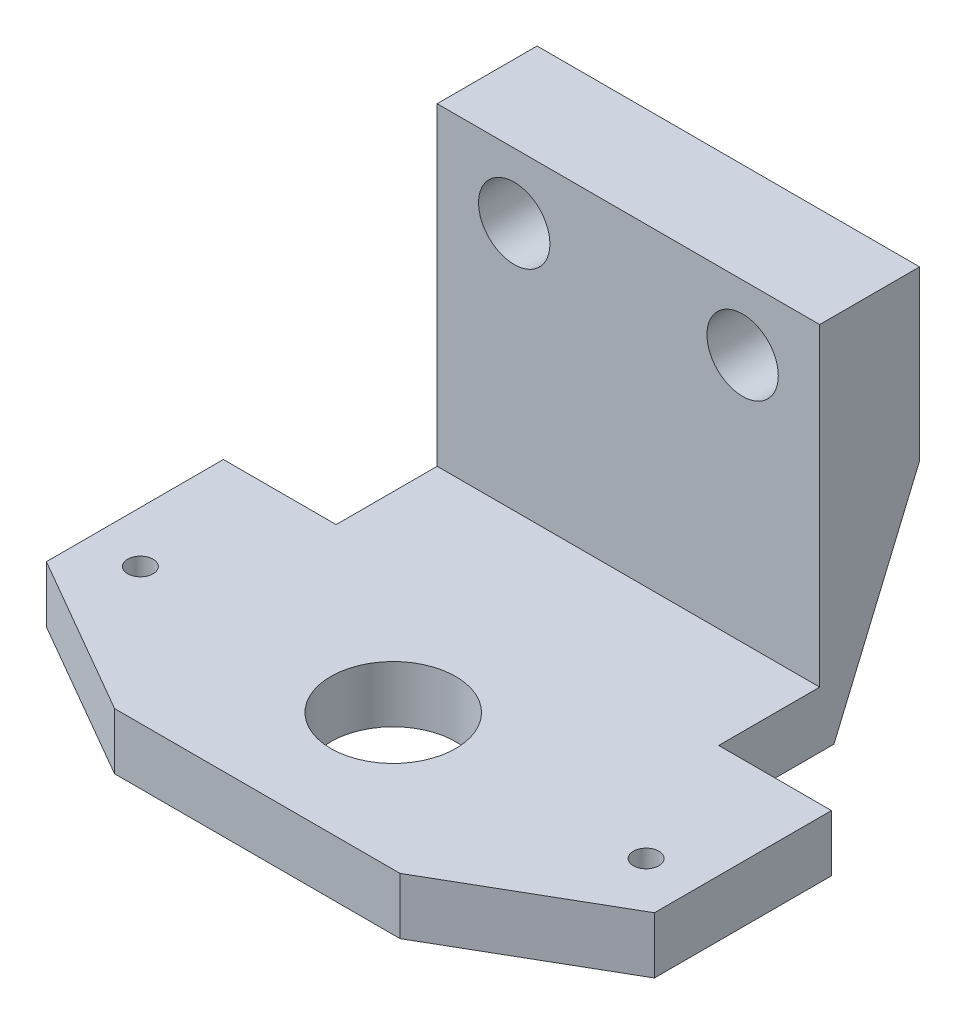
ISO-10303-21;
HEADER;
FILE_DESCRIPTION(('STEP AP214'),'2;1');
FILE_NAME('part.step','',(''),(''),'','','');
FILE_SCHEMA(('AUTOMOTIVE_DESIGN { 1 0 10303 214 1 1 1 1 }'));
ENDSEC;
DATA;
#1=APPLICATION_CONTEXT('core data for automotive mechanical design processes');
#2=APPLICATION_PROTOCOL_DEFINITION('international standard','automotive_design',2000,#1);
#3=PRODUCT_CONTEXT('',#1,'mechanical');
#4=PRODUCT('Part','Part','',(#3));
#5=PRODUCT_RELATED_PRODUCT_CATEGORY('part','',(#4));
#6=PRODUCT_DEFINITION_FORMATION('','',#4);
#7=PRODUCT_DEFINITION_CONTEXT('part definition',#1,'design');
#8=PRODUCT_DEFINITION('design','',#6,#7);
#9=PRODUCT_DEFINITION_SHAPE('','',#8);
#10=(LENGTH_UNIT() NAMED_UNIT(*) SI_UNIT(.MILLI.,.METRE.));
#11=(NAMED_UNIT(*) PLANE_ANGLE_UNIT() SI_UNIT($,.RADIAN.));
#12=(NAMED_UNIT(*) SI_UNIT($,.STERADIAN.) SOLID_ANGLE_UNIT());
#13=UNCERTAINTY_MEASURE_WITH_UNIT(LENGTH_MEASURE(1.E-05),#10,'distance_accuracy_value','');
#14=(GEOMETRIC_REPRESENTATION_CONTEXT(3) GLOBAL_UNCERTAINTY_ASSIGNED_CONTEXT((#13)) GLOBAL_UNIT_ASSIGNED_CONTEXT((#10,
#11,#12)) REPRESENTATION_CONTEXT('',''));
#15=CARTESIAN_POINT('',(0.,0.,0.));
#16=DIRECTION('',(0.,0.,1.));
#17=DIRECTION('',(1.,0.,0.));
#18=AXIS2_PLACEMENT_3D('',#15,#16,#17);
#19=CARTESIAN_POINT('',(17.018,5.0292,-16.8604462868597));
#20=DIRECTION('',(1.,0.,0.));
#21=DIRECTION('',(0.,0.,-1.));
#22=AXIS2_PLACEMENT_3D('',#19,#20,#21);
#23=PLANE('',#22);
#24=DIRECTION('',(0.,0.,1.));
#25=VECTOR('',#24,1.);
#26=CARTESIAN_POINT('',(17.018,0.,-16.8604462868597));
#27=LINE('',#26,#25);
#28=CARTESIAN_POINT('',(17.018,0.,-18.1304462868597));
#29=VERTEX_POINT('',#28);
#30=CARTESIAN_POINT('',(17.018,0.,-7.874));
#31=VERTEX_POINT('',#30);
#32=EDGE_CURVE('E155',#29,#31,#27,.T.);
#33=ORIENTED_EDGE('',*,*,#32,.F.);
#34=DIRECTION('',(0.,0.921146216293932,-0.389216711110112));
#35=VECTOR('',#34,1.);
#36=CARTESIAN_POINT('',(17.018,3.81200087527352,-19.7411508820457));
#37=LINE('',#36,#35);
#38=CARTESIAN_POINT('',(17.018,18.034,-25.7504462868597));
#39=VERTEX_POINT('',#38);
#40=EDGE_CURVE('E153',#29,#39,#37,.T.);
#41=ORIENTED_EDGE('',*,*,#40,.T.);
#42=DIRECTION('',(0.,-1.,0.));
#43=VECTOR('',#42,1.);
#44=CARTESIAN_POINT('',(17.018,32.9692,-25.7504462868597));
#45=LINE('',#44,#43);
#46=CARTESIAN_POINT('',(17.018,32.9692,-25.7504462868597));
#47=VERTEX_POINT('',#46);
#48=EDGE_CURVE('E141',#47,#39,#45,.T.);
#49=ORIENTED_EDGE('',*,*,#48,.F.);
#50=DIRECTION('',(0.,0.,-1.));
#51=VECTOR('',#50,1.);
#52=CARTESIAN_POINT('',(17.018,32.9692,-25.7504462868597));
#53=LINE('',#52,#51);
#54=CARTESIAN_POINT('',(17.018,32.9692,-16.8604462868597));
#55=VERTEX_POINT('',#54);
#56=EDGE_CURVE('E174',#55,#47,#53,.T.);
#57=ORIENTED_EDGE('',*,*,#56,.F.);
#58=DIRECTION('',(0.,-1.,0.));
#59=VECTOR('',#58,1.);
#60=CARTESIAN_POINT('',(17.018,32.9692,-16.8604462868597));
#61=LINE('',#60,#59);
#62=CARTESIAN_POINT('',(17.018,5.0292,-16.8604462868597));
#63=VERTEX_POINT('',#62);
#64=EDGE_CURVE('E149',#55,#63,#61,.T.);
#65=ORIENTED_EDGE('',*,*,#64,.T.);
#66=DIRECTION('',(0.,0.,1.));
#67=VECTOR('',#66,1.);
#68=CARTESIAN_POINT('',(17.018,5.0292,-16.8604462868597));
#69=LINE('',#68,#67);
#70=CARTESIAN_POINT('',(17.018,5.0292,-7.874));
#71=VERTEX_POINT('',#70);
#72=EDGE_CURVE('E206',#63,#71,#69,.T.);
#73=ORIENTED_EDGE('',*,*,#72,.T.);
#74=DIRECTION('',(0.,-1.,0.));
#75=VECTOR('',#74,1.);
#76=CARTESIAN_POINT('',(17.018,5.0292,-7.874));
#77=LINE('',#76,#75);
#78=EDGE_CURVE('E276',#71,#31,#77,.T.);
#79=ORIENTED_EDGE('',*,*,#78,.T.);
#80=EDGE_LOOP('',(#33,#41,#49,#57,#65,#73,#79));
#81=FACE_BOUND('',#80,.T.);
#82=ADVANCED_FACE('F43',(#81),#23,.T.);
#83=CARTESIAN_POINT('',(-17.018,5.0292,-7.874));
#84=DIRECTION('',(-1.,0.,0.));
#85=DIRECTION('',(0.,0.,1.));
#86=AXIS2_PLACEMENT_3D('',#83,#84,#85);
#87=PLANE('',#86);
#88=DIRECTION('',(0.,-1.,0.));
#89=VECTOR('',#88,1.);
#90=CARTESIAN_POINT('',(-17.018,32.9692,-25.7504462868597));
#91=LINE('',#90,#89);
#92=CARTESIAN_POINT('',(-17.018,32.9692,-25.7504462868597));
#93=VERTEX_POINT('',#92);
#94=CARTESIAN_POINT('',(-17.018,18.034,-25.7504462868597));
#95=VERTEX_POINT('',#94);
#96=EDGE_CURVE('E150',#93,#95,#91,.T.);
#97=ORIENTED_EDGE('',*,*,#96,.T.);
#98=DIRECTION('',(0.,-0.921146216293932,0.389216711110112));
#99=VECTOR('',#98,1.);
#100=CARTESIAN_POINT('',(-17.018,0.590130720247251,-18.3797972954148));
#101=LINE('',#100,#99);
#102=CARTESIAN_POINT('',(-17.018,0.,-18.1304462868597));
#103=VERTEX_POINT('',#102);
#104=EDGE_CURVE('E67',#95,#103,#101,.T.);
#105=ORIENTED_EDGE('',*,*,#104,.T.);
#106=DIRECTION('',(0.,0.,-1.));
#107=VECTOR('',#106,1.);
#108=CARTESIAN_POINT('',(-17.018,0.,-7.874));
#109=LINE('',#108,#107);
#110=CARTESIAN_POINT('',(-17.018,0.,-7.874));
#111=VERTEX_POINT('',#110);
#112=EDGE_CURVE('E238',#111,#103,#109,.T.);
#113=ORIENTED_EDGE('',*,*,#112,.F.);
#114=DIRECTION('',(0.,-1.,0.));
#115=VECTOR('',#114,1.);
#116=CARTESIAN_POINT('',(-17.018,5.0292,-7.874));
#117=LINE('',#116,#115);
#118=CARTESIAN_POINT('',(-17.018,5.0292,-7.874));
#119=VERTEX_POINT('',#118);
#120=EDGE_CURVE('E279',#119,#111,#117,.T.);
#121=ORIENTED_EDGE('',*,*,#120,.F.);
#122=DIRECTION('',(0.,0.,-1.));
#123=VECTOR('',#122,1.);
#124=CARTESIAN_POINT('',(-17.018,5.0292,-7.874));
#125=LINE('',#124,#123);
#126=CARTESIAN_POINT('',(-17.018,5.0292,-16.8604462868597));
#127=VERTEX_POINT('',#126);
#128=EDGE_CURVE('E198',#119,#127,#125,.T.);
#129=ORIENTED_EDGE('',*,*,#128,.T.);
#130=DIRECTION('',(0.,-1.,0.));
#131=VECTOR('',#130,1.);
#132=CARTESIAN_POINT('',(-17.018,32.9692,-16.8604462868597));
#133=LINE('',#132,#131);
#134=CARTESIAN_POINT('',(-17.018,32.9692,-16.8604462868597));
#135=VERTEX_POINT('',#134);
#136=EDGE_CURVE('E184',#135,#127,#133,.T.);
#137=ORIENTED_EDGE('',*,*,#136,.F.);
#138=DIRECTION('',(0.,0.,1.));
#139=VECTOR('',#138,1.);
#140=CARTESIAN_POINT('',(-17.018,32.9692,-25.7504462868597));
#141=LINE('',#140,#139);
#142=EDGE_CURVE('E158',#93,#135,#141,.T.);
#143=ORIENTED_EDGE('',*,*,#142,.F.);
#144=EDGE_LOOP('',(#97,#105,#113,#121,#129,#137,#143));
#145=FACE_BOUND('',#144,.T.);
#146=ADVANCED_FACE('F300',(#145),#87,.T.);
#147=CARTESIAN_POINT('',(0.,0.,0.));
#148=DIRECTION('',(0.,-1.,0.));
#149=DIRECTION('',(0.,0.,-1.));
#150=AXIS2_PLACEMENT_3D('',#147,#148,#149);
#151=PLANE('',#150);
#152=CARTESIAN_POINT('',(-22.5,0.,4.064));
#153=DIRECTION('',(0.,1.,0.));
#154=DIRECTION('',(0.,0.,1.));
#155=AXIS2_PLACEMENT_3D('',#152,#153,#154);
#156=CIRCLE('',#155,1.1303);
#157=CARTESIAN_POINT('',(-22.5,0.,5.1943));
#158=VERTEX_POINT('',#157);
#159=EDGE_CURVE('E530',#158,#158,#156,.T.);
#160=ORIENTED_EDGE('',*,*,#159,.T.);
#161=EDGE_LOOP('',(#160));
#162=FACE_BOUND('',#161,.T.);
#163=CARTESIAN_POINT('',(22.5,0.,4.064));
#164=DIRECTION('',(0.,1.,0.));
#165=DIRECTION('',(0.,0.,1.));
#166=AXIS2_PLACEMENT_3D('',#163,#164,#165);
#167=CIRCLE('',#166,1.1303);
#168=CARTESIAN_POINT('',(22.5,0.,5.1943));
#169=VERTEX_POINT('',#168);
#170=EDGE_CURVE('E519',#169,#169,#167,.T.);
#171=ORIENTED_EDGE('',*,*,#170,.T.);
#172=EDGE_LOOP('',(#171));
#173=FACE_BOUND('',#172,.T.);
#174=CARTESIAN_POINT('',(0.,0.,4.064));
#175=DIRECTION('',(0.,1.,0.));
#176=DIRECTION('',(0.,0.,1.));
#177=AXIS2_PLACEMENT_3D('',#174,#175,#176);
#178=CIRCLE('',#177,5.55625);
#179=CARTESIAN_POINT('',(0.,0.,9.62025));
#180=VERTEX_POINT('',#179);
#181=EDGE_CURVE('E514',#180,#180,#178,.T.);
#182=ORIENTED_EDGE('',*,*,#181,.T.);
#183=EDGE_LOOP('',(#182));
#184=FACE_BOUND('',#183,.T.);
#185=ORIENTED_EDGE('',*,*,#112,.T.);
#186=DIRECTION('',(-1.,0.,0.));
#187=VECTOR('',#186,1.);
#188=CARTESIAN_POINT('',(167.058537132019,0.,-18.1304462868597));
#189=LINE('',#188,#187);
#190=EDGE_CURVE('E59',#29,#103,#189,.T.);
#191=ORIENTED_EDGE('',*,*,#190,.F.);
#192=ORIENTED_EDGE('',*,*,#32,.T.);
#193=DIRECTION('',(1.,0.,0.));
#194=VECTOR('',#193,1.);
#195=CARTESIAN_POINT('',(17.018,0.,-7.874));
#196=LINE('',#195,#194);
#197=CARTESIAN_POINT('',(27.051,0.,-7.874));
#198=VERTEX_POINT('',#197);
#199=EDGE_CURVE('E243',#31,#198,#196,.T.);
#200=ORIENTED_EDGE('',*,*,#199,.T.);
#201=DIRECTION('',(0.,0.,1.));
#202=VECTOR('',#201,1.);
#203=CARTESIAN_POINT('',(27.051,0.,-7.874));
#204=LINE('',#203,#202);
#205=CARTESIAN_POINT('',(27.051,0.,7.874));
#206=VERTEX_POINT('',#205);
#207=EDGE_CURVE('E247',#198,#206,#204,.T.);
#208=ORIENTED_EDGE('',*,*,#207,.T.);
#209=DIRECTION('',(-0.866025403784438,0.,0.500000000000001));
#210=VECTOR('',#209,1.);
#211=CARTESIAN_POINT('',(27.051,0.,7.874));
#212=LINE('',#211,#210);
#213=CARTESIAN_POINT('',(12.7,0.,16.1595537131403));
#214=VERTEX_POINT('',#213);
#215=EDGE_CURVE('E251',#206,#214,#212,.T.);
#216=ORIENTED_EDGE('',*,*,#215,.T.);
#217=DIRECTION('',(-1.,0.,0.));
#218=VECTOR('',#217,1.);
#219=CARTESIAN_POINT('',(12.7,0.,16.1595537131403));
#220=LINE('',#219,#218);
#221=CARTESIAN_POINT('',(-12.7,0.,16.1595537131403));
#222=VERTEX_POINT('',#221);
#223=EDGE_CURVE('E255',#214,#222,#220,.T.);
#224=ORIENTED_EDGE('',*,*,#223,.T.);
#225=DIRECTION('',(-0.866025403784438,0.,-0.500000000000001));
#226=VECTOR('',#225,1.);
#227=CARTESIAN_POINT('',(-12.7,0.,16.1595537131403));
#228=LINE('',#227,#226);
#229=CARTESIAN_POINT('',(-27.051,0.,7.874));
#230=VERTEX_POINT('',#229);
#231=EDGE_CURVE('E194',#222,#230,#228,.T.);
#232=ORIENTED_EDGE('',*,*,#231,.T.);
#233=DIRECTION('',(0.,0.,-1.));
#234=VECTOR('',#233,1.);
#235=CARTESIAN_POINT('',(-27.051,0.,7.874));
#236=LINE('',#235,#234);
#237=CARTESIAN_POINT('',(-27.051,0.,-7.874));
#238=VERTEX_POINT('',#237);
#239=EDGE_CURVE('E188',#230,#238,#236,.T.);
#240=ORIENTED_EDGE('',*,*,#239,.T.);
#241=DIRECTION('',(1.,0.,0.));
#242=VECTOR('',#241,1.);
#243=CARTESIAN_POINT('',(-27.051,0.,-7.874));
#244=LINE('',#243,#242);
#245=EDGE_CURVE('E234',#238,#111,#244,.T.);
#246=ORIENTED_EDGE('',*,*,#245,.T.);
#247=EDGE_LOOP('',(#185,#191,#192,#200,#208,#216,#224,#232,#240,#246));
#248=FACE_BOUND('',#247,.T.);
#249=ADVANCED_FACE('F289',(#162,#173,#184,#248),#151,.T.);
#250=CARTESIAN_POINT('',(17.018,32.9692,-25.7504462868597));
#251=DIRECTION('',(0.,0.,1.));
#252=DIRECTION('',(1.,0.,0.));
#253=AXIS2_PLACEMENT_3D('',#250,#251,#252);
#254=PLANE('',#253);
#255=CARTESIAN_POINT('',(-10.16,27.178,-25.7504462868597));
#256=DIRECTION('',(0.,0.,1.));
#257=DIRECTION('',(1.,0.,0.));
#258=AXIS2_PLACEMENT_3D('',#255,#256,#257);
#259=CIRCLE('',#258,3.175);
#260=CARTESIAN_POINT('',(-6.985,27.178,-25.7504462868597));
#261=VERTEX_POINT('',#260);
#262=EDGE_CURVE('E504',#261,#261,#259,.T.);
#263=ORIENTED_EDGE('',*,*,#262,.T.);
#264=EDGE_LOOP('',(#263));
#265=FACE_BOUND('',#264,.T.);
#266=CARTESIAN_POINT('',(10.16,27.178,-25.7504462868597));
#267=DIRECTION('',(0.,0.,1.));
#268=DIRECTION('',(1.,0.,0.));
#269=AXIS2_PLACEMENT_3D('',#266,#267,#268);
#270=CIRCLE('',#269,3.175);
#271=CARTESIAN_POINT('',(13.335,27.178,-25.7504462868597));
#272=VERTEX_POINT('',#271);
#273=EDGE_CURVE('E164',#272,#272,#270,.T.);
#274=ORIENTED_EDGE('',*,*,#273,.T.);
#275=EDGE_LOOP('',(#274));
#276=FACE_BOUND('',#275,.T.);
#277=DIRECTION('',(1.,0.,0.));
#278=VECTOR('',#277,1.);
#279=CARTESIAN_POINT('',(17.018,18.034,-25.7504462868597));
#280=LINE('',#279,#278);
#281=EDGE_CURVE('E11',#95,#39,#280,.T.);
#282=ORIENTED_EDGE('',*,*,#281,.F.);
#283=ORIENTED_EDGE('',*,*,#96,.F.);
#284=DIRECTION('',(-1.,0.,0.));
#285=VECTOR('',#284,1.);
#286=CARTESIAN_POINT('',(17.018,32.9692,-25.7504462868597));
#287=LINE('',#286,#285);
#288=EDGE_CURVE('E145',#47,#93,#287,.T.);
#289=ORIENTED_EDGE('',*,*,#288,.F.);
#290=ORIENTED_EDGE('',*,*,#48,.T.);
#291=EDGE_LOOP('',(#282,#283,#289,#290));
#292=FACE_BOUND('',#291,.T.);
#293=ADVANCED_FACE('F143',(#265,#276,#292),#254,.F.);
#294=CARTESIAN_POINT('',(-27.051,5.0292,7.874));
#295=DIRECTION('',(-1.,0.,0.));
#296=DIRECTION('',(0.,0.,1.));
#297=AXIS2_PLACEMENT_3D('',#294,#295,#296);
#298=PLANE('',#297);
#299=ORIENTED_EDGE('',*,*,#239,.F.);
#300=DIRECTION('',(0.,-1.,0.));
#301=VECTOR('',#300,1.);
#302=CARTESIAN_POINT('',(-27.051,5.0292,7.874));
#303=LINE('',#302,#301);
#304=CARTESIAN_POINT('',(-27.051,5.0292,7.874));
#305=VERTEX_POINT('',#304);
#306=EDGE_CURVE('E52',#305,#230,#303,.T.);
#307=ORIENTED_EDGE('',*,*,#306,.F.);
#308=DIRECTION('',(0.,0.,-1.));
#309=VECTOR('',#308,1.);
#310=CARTESIAN_POINT('',(-27.051,5.0292,7.874));
#311=LINE('',#310,#309);
#312=CARTESIAN_POINT('',(-27.051,5.0292,-7.874));
#313=VERTEX_POINT('',#312);
#314=EDGE_CURVE('E189',#305,#313,#311,.T.);
#315=ORIENTED_EDGE('',*,*,#314,.T.);
#316=DIRECTION('',(0.,-1.,0.));
#317=VECTOR('',#316,1.);
#318=CARTESIAN_POINT('',(-27.051,5.0292,-7.874));
#319=LINE('',#318,#317);
#320=EDGE_CURVE('E230',#313,#238,#319,.T.);
#321=ORIENTED_EDGE('',*,*,#320,.T.);
#322=EDGE_LOOP('',(#299,#307,#315,#321));
#323=FACE_BOUND('',#322,.T.);
#324=ADVANCED_FACE('F45',(#323),#298,.T.);
#325=CARTESIAN_POINT('',(-12.7,5.0292,16.1595537131403));
#326=DIRECTION('',(-0.500000000000001,0.,0.866025403784438));
#327=DIRECTION('',(0.866025403784438,0.,0.500000000000001));
#328=AXIS2_PLACEMENT_3D('',#325,#326,#327);
#329=PLANE('',#328);
#330=ORIENTED_EDGE('',*,*,#231,.F.);
#331=DIRECTION('',(0.,-1.,0.));
#332=VECTOR('',#331,1.);
#333=CARTESIAN_POINT('',(-12.7,5.0292,16.1595537131403));
#334=LINE('',#333,#332);
#335=CARTESIAN_POINT('',(-12.7,5.0292,16.1595537131403));
#336=VERTEX_POINT('',#335);
#337=EDGE_CURVE('E264',#336,#222,#334,.T.);
#338=ORIENTED_EDGE('',*,*,#337,.F.);
#339=DIRECTION('',(-0.866025403784438,0.,-0.500000000000001));
#340=VECTOR('',#339,1.);
#341=CARTESIAN_POINT('',(-12.7,5.0292,16.1595537131403));
#342=LINE('',#341,#340);
#343=EDGE_CURVE('E226',#336,#305,#342,.T.);
#344=ORIENTED_EDGE('',*,*,#343,.T.);
#345=ORIENTED_EDGE('',*,*,#306,.T.);
#346=EDGE_LOOP('',(#330,#338,#344,#345));
#347=FACE_BOUND('',#346,.T.);
#348=ADVANCED_FACE('F293',(#347),#329,.T.);
#349=CARTESIAN_POINT('',(12.7,5.0292,16.1595537131403));
#350=DIRECTION('',(0.,0.,1.));
#351=DIRECTION('',(1.,0.,0.));
#352=AXIS2_PLACEMENT_3D('',#349,#350,#351);
#353=PLANE('',#352);
#354=ORIENTED_EDGE('',*,*,#223,.F.);
#355=DIRECTION('',(0.,-1.,0.));
#356=VECTOR('',#355,1.);
#357=CARTESIAN_POINT('',(12.7,5.0292,16.1595537131403));
#358=LINE('',#357,#356);
#359=CARTESIAN_POINT('',(12.7,5.0292,16.1595537131403));
#360=VERTEX_POINT('',#359);
#361=EDGE_CURVE('E267',#360,#214,#358,.T.);
#362=ORIENTED_EDGE('',*,*,#361,.F.);
#363=DIRECTION('',(-1.,0.,0.));
#364=VECTOR('',#363,1.);
#365=CARTESIAN_POINT('',(12.7,5.0292,16.1595537131403));
#366=LINE('',#365,#364);
#367=EDGE_CURVE('E222',#360,#336,#366,.T.);
#368=ORIENTED_EDGE('',*,*,#367,.T.);
#369=ORIENTED_EDGE('',*,*,#337,.T.);
#370=EDGE_LOOP('',(#354,#362,#368,#369));
#371=FACE_BOUND('',#370,.T.);
#372=ADVANCED_FACE('F320',(#371),#353,.T.);
#373=CARTESIAN_POINT('',(27.051,5.0292,7.874));
#374=DIRECTION('',(0.500000000000001,0.,0.866025403784438));
#375=DIRECTION('',(0.866025403784438,0.,-0.500000000000001));
#376=AXIS2_PLACEMENT_3D('',#373,#374,#375);
#377=PLANE('',#376);
#378=ORIENTED_EDGE('',*,*,#215,.F.);
#379=DIRECTION('',(0.,-1.,0.));
#380=VECTOR('',#379,1.);
#381=CARTESIAN_POINT('',(27.051,5.0292,7.874));
#382=LINE('',#381,#380);
#383=CARTESIAN_POINT('',(27.051,5.0292,7.874));
#384=VERTEX_POINT('',#383);
#385=EDGE_CURVE('E270',#384,#206,#382,.T.);
#386=ORIENTED_EDGE('',*,*,#385,.F.);
#387=DIRECTION('',(-0.866025403784438,0.,0.500000000000001));
#388=VECTOR('',#387,1.);
#389=CARTESIAN_POINT('',(27.051,5.0292,7.874));
#390=LINE('',#389,#388);
#391=EDGE_CURVE('E218',#384,#360,#390,.T.);
#392=ORIENTED_EDGE('',*,*,#391,.T.);
#393=ORIENTED_EDGE('',*,*,#361,.T.);
#394=EDGE_LOOP('',(#378,#386,#392,#393));
#395=FACE_BOUND('',#394,.T.);
#396=ADVANCED_FACE('F318',(#395),#377,.T.);
#397=CARTESIAN_POINT('',(27.051,5.0292,-7.874));
#398=DIRECTION('',(1.,0.,0.));
#399=DIRECTION('',(0.,0.,-1.));
#400=AXIS2_PLACEMENT_3D('',#397,#398,#399);
#401=PLANE('',#400);
#402=ORIENTED_EDGE('',*,*,#207,.F.);
#403=DIRECTION('',(0.,-1.,0.));
#404=VECTOR('',#403,1.);
#405=CARTESIAN_POINT('',(27.051,5.0292,-7.874));
#406=LINE('',#405,#404);
#407=CARTESIAN_POINT('',(27.051,5.0292,-7.874));
#408=VERTEX_POINT('',#407);
#409=EDGE_CURVE('E273',#408,#198,#406,.T.);
#410=ORIENTED_EDGE('',*,*,#409,.F.);
#411=DIRECTION('',(0.,0.,1.));
#412=VECTOR('',#411,1.);
#413=CARTESIAN_POINT('',(27.051,5.0292,-7.874));
#414=LINE('',#413,#412);
#415=EDGE_CURVE('E214',#408,#384,#414,.T.);
#416=ORIENTED_EDGE('',*,*,#415,.T.);
#417=ORIENTED_EDGE('',*,*,#385,.T.);
#418=EDGE_LOOP('',(#402,#410,#416,#417));
#419=FACE_BOUND('',#418,.T.);
#420=ADVANCED_FACE('F316',(#419),#401,.T.);
#421=CARTESIAN_POINT('',(17.018,5.0292,-7.874));
#422=DIRECTION('',(0.,0.,-1.));
#423=DIRECTION('',(-1.,0.,0.));
#424=AXIS2_PLACEMENT_3D('',#421,#422,#423);
#425=PLANE('',#424);
#426=ORIENTED_EDGE('',*,*,#199,.F.);
#427=ORIENTED_EDGE('',*,*,#78,.F.);
#428=DIRECTION('',(1.,0.,0.));
#429=VECTOR('',#428,1.);
#430=CARTESIAN_POINT('',(17.018,5.0292,-7.874));
#431=LINE('',#430,#429);
#432=EDGE_CURVE('E210',#71,#408,#431,.T.);
#433=ORIENTED_EDGE('',*,*,#432,.T.);
#434=ORIENTED_EDGE('',*,*,#409,.T.);
#435=EDGE_LOOP('',(#426,#427,#433,#434));
#436=FACE_BOUND('',#435,.T.);
#437=ADVANCED_FACE('F312',(#436),#425,.T.);
#438=CARTESIAN_POINT('',(-27.051,5.0292,-7.874));
#439=DIRECTION('',(0.,0.,-1.));
#440=DIRECTION('',(-1.,0.,0.));
#441=AXIS2_PLACEMENT_3D('',#438,#439,#440);
#442=PLANE('',#441);
#443=ORIENTED_EDGE('',*,*,#245,.F.);
#444=ORIENTED_EDGE('',*,*,#320,.F.);
#445=DIRECTION('',(1.,0.,0.));
#446=VECTOR('',#445,1.);
#447=CARTESIAN_POINT('',(-27.051,5.0292,-7.874));
#448=LINE('',#447,#446);
#449=EDGE_CURVE('E193',#313,#119,#448,.T.);
#450=ORIENTED_EDGE('',*,*,#449,.T.);
#451=ORIENTED_EDGE('',*,*,#120,.T.);
#452=EDGE_LOOP('',(#443,#444,#450,#451));
#453=FACE_BOUND('',#452,.T.);
#454=ADVANCED_FACE('F288',(#453),#442,.T.);
#455=CARTESIAN_POINT('',(0.,5.0292,0.));
#456=DIRECTION('',(0.,-1.,0.));
#457=DIRECTION('',(0.,0.,-1.));
#458=AXIS2_PLACEMENT_3D('',#455,#456,#457);
#459=PLANE('',#458);
#460=CARTESIAN_POINT('',(-22.5,5.0292,4.064));
#461=DIRECTION('',(0.,1.,0.));
#462=DIRECTION('',(0.,0.,1.));
#463=AXIS2_PLACEMENT_3D('',#460,#461,#462);
#464=CIRCLE('',#463,1.1303);
#465=CARTESIAN_POINT('',(-22.5,5.0292,5.1943));
#466=VERTEX_POINT('',#465);
#467=EDGE_CURVE('E534',#466,#466,#464,.T.);
#468=ORIENTED_EDGE('',*,*,#467,.F.);
#469=EDGE_LOOP('',(#468));
#470=FACE_BOUND('',#469,.T.);
#471=CARTESIAN_POINT('',(22.5,5.0292,4.064));
#472=DIRECTION('',(0.,1.,0.));
#473=DIRECTION('',(0.,0.,1.));
#474=AXIS2_PLACEMENT_3D('',#471,#472,#473);
#475=CIRCLE('',#474,1.1303);
#476=CARTESIAN_POINT('',(22.5,5.0292,5.1943));
#477=VERTEX_POINT('',#476);
#478=EDGE_CURVE('E526',#477,#477,#475,.T.);
#479=ORIENTED_EDGE('',*,*,#478,.F.);
#480=EDGE_LOOP('',(#479));
#481=FACE_BOUND('',#480,.T.);
#482=CARTESIAN_POINT('',(0.,5.0292,4.064));
#483=DIRECTION('',(0.,1.,0.));
#484=DIRECTION('',(0.,0.,1.));
#485=AXIS2_PLACEMENT_3D('',#482,#483,#484);
#486=CIRCLE('',#485,5.55625);
#487=CARTESIAN_POINT('',(0.,5.0292,9.62025));
#488=VERTEX_POINT('',#487);
#489=EDGE_CURVE('E515',#488,#488,#486,.T.);
#490=ORIENTED_EDGE('',*,*,#489,.F.);
#491=EDGE_LOOP('',(#490));
#492=FACE_BOUND('',#491,.T.);
#493=ORIENTED_EDGE('',*,*,#314,.F.);
#494=ORIENTED_EDGE('',*,*,#343,.F.);
#495=ORIENTED_EDGE('',*,*,#367,.F.);
#496=ORIENTED_EDGE('',*,*,#391,.F.);
#497=ORIENTED_EDGE('',*,*,#415,.F.);
#498=ORIENTED_EDGE('',*,*,#432,.F.);
#499=ORIENTED_EDGE('',*,*,#72,.F.);
#500=DIRECTION('',(1.,0.,0.));
#501=VECTOR('',#500,1.);
#502=CARTESIAN_POINT('',(-17.018,5.0292,-16.8604462868597));
#503=LINE('',#502,#501);
#504=EDGE_CURVE('E202',#127,#63,#503,.T.);
#505=ORIENTED_EDGE('',*,*,#504,.F.);
#506=ORIENTED_EDGE('',*,*,#128,.F.);
#507=ORIENTED_EDGE('',*,*,#449,.F.);
#508=EDGE_LOOP('',(#493,#494,#495,#496,#497,#498,#499,#505,#506,#507));
#509=FACE_BOUND('',#508,.T.);
#510=ADVANCED_FACE('F296',(#470,#481,#492,#509),#459,.F.);
#511=CARTESIAN_POINT('',(17.018,32.9692,-16.8604462868597));
#512=DIRECTION('',(0.,0.,-1.));
#513=DIRECTION('',(-1.,0.,0.));
#514=AXIS2_PLACEMENT_3D('',#511,#512,#513);
#515=PLANE('',#514);
#516=CARTESIAN_POINT('',(-10.16,27.178,-16.8604462868597));
#517=DIRECTION('',(0.,0.,1.));
#518=DIRECTION('',(1.,0.,0.));
#519=AXIS2_PLACEMENT_3D('',#516,#517,#518);
#520=CIRCLE('',#519,3.175);
#521=CARTESIAN_POINT('',(-6.985,27.178,-16.8604462868597));
#522=VERTEX_POINT('',#521);
#523=EDGE_CURVE('E498',#522,#522,#520,.T.);
#524=ORIENTED_EDGE('',*,*,#523,.F.);
#525=EDGE_LOOP('',(#524));
#526=FACE_BOUND('',#525,.T.);
#527=CARTESIAN_POINT('',(10.16,27.178,-16.8604462868597));
#528=DIRECTION('',(0.,0.,1.));
#529=DIRECTION('',(1.,0.,0.));
#530=AXIS2_PLACEMENT_3D('',#527,#528,#529);
#531=CIRCLE('',#530,3.175);
#532=CARTESIAN_POINT('',(13.335,27.178,-16.8604462868597));
#533=VERTEX_POINT('',#532);
#534=EDGE_CURVE('E501',#533,#533,#531,.T.);
#535=ORIENTED_EDGE('',*,*,#534,.F.);
#536=EDGE_LOOP('',(#535));
#537=FACE_BOUND('',#536,.T.);
#538=ORIENTED_EDGE('',*,*,#136,.T.);
#539=ORIENTED_EDGE('',*,*,#504,.T.);
#540=ORIENTED_EDGE('',*,*,#64,.F.);
#541=DIRECTION('',(1.,0.,0.));
#542=VECTOR('',#541,1.);
#543=CARTESIAN_POINT('',(17.018,32.9692,-16.8604462868597));
#544=LINE('',#543,#542);
#545=EDGE_CURVE('E171',#135,#55,#544,.T.);
#546=ORIENTED_EDGE('',*,*,#545,.F.);
#547=EDGE_LOOP('',(#538,#539,#540,#546));
#548=FACE_BOUND('',#547,.T.);
#549=ADVANCED_FACE('F303',(#526,#537,#548),#515,.F.);
#550=CARTESIAN_POINT('',(0.,32.9692,0.));
#551=DIRECTION('',(0.,-1.,0.));
#552=DIRECTION('',(0.,0.,-1.));
#553=AXIS2_PLACEMENT_3D('',#550,#551,#552);
#554=PLANE('',#553);
#555=ORIENTED_EDGE('',*,*,#142,.T.);
#556=ORIENTED_EDGE('',*,*,#545,.T.);
#557=ORIENTED_EDGE('',*,*,#56,.T.);
#558=ORIENTED_EDGE('',*,*,#288,.T.);
#559=EDGE_LOOP('',(#555,#556,#557,#558));
#560=FACE_BOUND('',#559,.T.);
#561=ADVANCED_FACE('F306',(#560),#554,.F.);
#562=CARTESIAN_POINT('',(167.058537132019,18.034,-25.7504462868597));
#563=DIRECTION('',(0.,-0.389216711110112,-0.921146216293932));
#564=DIRECTION('',(0.,0.921146216293932,-0.389216711110112));
#565=AXIS2_PLACEMENT_3D('',#562,#563,#564);
#566=PLANE('',#565);
#567=ORIENTED_EDGE('',*,*,#40,.F.);
#568=ORIENTED_EDGE('',*,*,#190,.T.);
#569=ORIENTED_EDGE('',*,*,#104,.F.);
#570=ORIENTED_EDGE('',*,*,#281,.T.);
#571=EDGE_LOOP('',(#567,#568,#569,#570));
#572=FACE_BOUND('',#571,.T.);
#573=ADVANCED_FACE('F160',(#572),#566,.T.);
#574=CARTESIAN_POINT('',(10.16,27.178,-16.8604462868597));
#575=DIRECTION('',(0.,0.,1.));
#576=DIRECTION('',(1.,0.,0.));
#577=AXIS2_PLACEMENT_3D('',#574,#575,#576);
#578=CYLINDRICAL_SURFACE('',#577,3.175);
#579=ORIENTED_EDGE('',*,*,#273,.F.);
#580=EDGE_LOOP('',(#579));
#581=FACE_BOUND('',#580,.T.);
#582=ORIENTED_EDGE('',*,*,#534,.T.);
#583=EDGE_LOOP('',(#582));
#584=FACE_BOUND('',#583,.T.);
#585=ADVANCED_FACE('F406',(#581,#584),#578,.F.);
#586=CARTESIAN_POINT('',(-10.16,27.178,-16.8604462868597));
#587=DIRECTION('',(0.,0.,1.));
#588=DIRECTION('',(1.,0.,0.));
#589=AXIS2_PLACEMENT_3D('',#586,#587,#588);
#590=CYLINDRICAL_SURFACE('',#589,3.175);
#591=ORIENTED_EDGE('',*,*,#262,.F.);
#592=EDGE_LOOP('',(#591));
#593=FACE_BOUND('',#592,.T.);
#594=ORIENTED_EDGE('',*,*,#523,.T.);
#595=EDGE_LOOP('',(#594));
#596=FACE_BOUND('',#595,.T.);
#597=ADVANCED_FACE('F419',(#593,#596),#590,.F.);
#598=CARTESIAN_POINT('',(0.,0.,4.064));
#599=DIRECTION('',(0.,1.,0.));
#600=DIRECTION('',(0.,0.,1.));
#601=AXIS2_PLACEMENT_3D('',#598,#599,#600);
#602=CYLINDRICAL_SURFACE('',#601,5.55625);
#603=ORIENTED_EDGE('',*,*,#181,.F.);
#604=EDGE_LOOP('',(#603));
#605=FACE_BOUND('',#604,.T.);
#606=ORIENTED_EDGE('',*,*,#489,.T.);
#607=EDGE_LOOP('',(#606));
#608=FACE_BOUND('',#607,.T.);
#609=ADVANCED_FACE('F426',(#605,#608),#602,.F.);
#610=CARTESIAN_POINT('',(22.5,5.0292,4.064));
#611=DIRECTION('',(0.,1.,0.));
#612=DIRECTION('',(0.,0.,1.));
#613=AXIS2_PLACEMENT_3D('',#610,#611,#612);
#614=CYLINDRICAL_SURFACE('',#613,1.1303);
#615=ORIENTED_EDGE('',*,*,#170,.F.);
#616=EDGE_LOOP('',(#615));
#617=FACE_BOUND('',#616,.T.);
#618=ORIENTED_EDGE('',*,*,#478,.T.);
#619=EDGE_LOOP('',(#618));
#620=FACE_BOUND('',#619,.T.);
#621=ADVANCED_FACE('F433',(#617,#620),#614,.F.);
#622=CARTESIAN_POINT('',(-22.5,5.0292,4.064));
#623=DIRECTION('',(0.,1.,0.));
#624=DIRECTION('',(0.,0.,1.));
#625=AXIS2_PLACEMENT_3D('',#622,#623,#624);
#626=CYLINDRICAL_SURFACE('',#625,1.1303);
#627=ORIENTED_EDGE('',*,*,#159,.F.);
#628=EDGE_LOOP('',(#627));
#629=FACE_BOUND('',#628,.T.);
#630=ORIENTED_EDGE('',*,*,#467,.T.);
#631=EDGE_LOOP('',(#630));
#632=FACE_BOUND('',#631,.T.);
#633=ADVANCED_FACE('F441',(#629,#632),#626,.F.);
#634=CLOSED_SHELL('',(#82,#146,#249,#293,#324,#348,#372,#396,#420,#437,#454,#510,#549,#561,#573,
#585,#597,#609,#621,#633));
#635=MANIFOLD_SOLID_BREP('B2',#634);
#636=ADVANCED_BREP_SHAPE_REPRESENTATION('',(#18,#635),#14);
#637=SHAPE_DEFINITION_REPRESENTATION(#9,#636);
ENDSEC;
END-ISO-10303-21;
